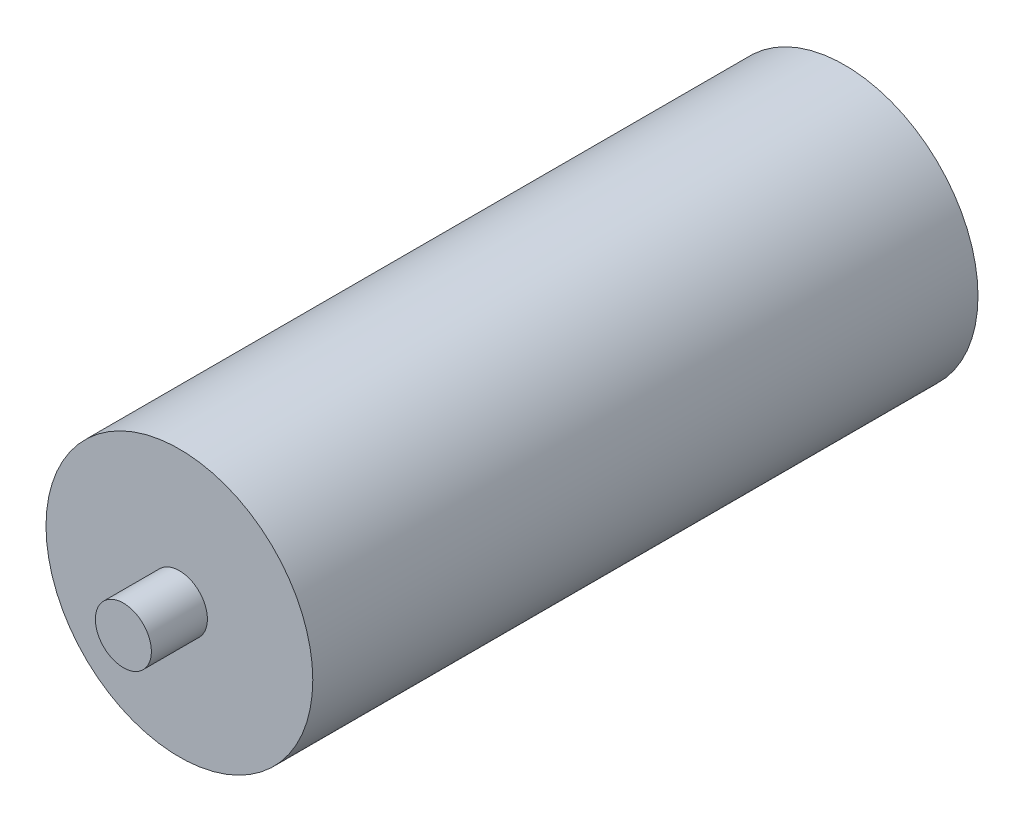
ISO-10303-21;
HEADER;
FILE_DESCRIPTION(('STEP AP214'),'2;1');
FILE_NAME('part.step','',(''),(''),'','','');
FILE_SCHEMA(('AUTOMOTIVE_DESIGN { 1 0 10303 214 1 1 1 1 }'));
ENDSEC;
DATA;
#1=APPLICATION_CONTEXT('core data for automotive mechanical design processes');
#2=APPLICATION_PROTOCOL_DEFINITION('international standard','automotive_design',2000,#1);
#3=PRODUCT_CONTEXT('',#1,'mechanical');
#4=PRODUCT('Part','Part','',(#3));
#5=PRODUCT_RELATED_PRODUCT_CATEGORY('part','',(#4));
#6=PRODUCT_DEFINITION_FORMATION('','',#4);
#7=PRODUCT_DEFINITION_CONTEXT('part definition',#1,'design');
#8=PRODUCT_DEFINITION('design','',#6,#7);
#9=PRODUCT_DEFINITION_SHAPE('','',#8);
#10=(LENGTH_UNIT() NAMED_UNIT(*) SI_UNIT(.MILLI.,.METRE.));
#11=(NAMED_UNIT(*) PLANE_ANGLE_UNIT() SI_UNIT($,.RADIAN.));
#12=(NAMED_UNIT(*) SI_UNIT($,.STERADIAN.) SOLID_ANGLE_UNIT());
#13=UNCERTAINTY_MEASURE_WITH_UNIT(LENGTH_MEASURE(1.E-05),#10,'distance_accuracy_value','');
#14=(GEOMETRIC_REPRESENTATION_CONTEXT(3) GLOBAL_UNCERTAINTY_ASSIGNED_CONTEXT((#13)) GLOBAL_UNIT_ASSIGNED_CONTEXT((#10,
#11,#12)) REPRESENTATION_CONTEXT('',''));
#15=CARTESIAN_POINT('',(0.,0.,0.));
#16=DIRECTION('',(0.,0.,1.));
#17=DIRECTION('',(1.,0.,0.));
#18=AXIS2_PLACEMENT_3D('',#15,#16,#17);
#19=CARTESIAN_POINT('',(0.,0.,47.498));
#20=DIRECTION('',(0.,0.,-1.));
#21=DIRECTION('',(-1.,0.,0.));
#22=AXIS2_PLACEMENT_3D('',#19,#20,#21);
#23=CYLINDRICAL_SURFACE('',#22,19.05);
#24=CARTESIAN_POINT('',(0.,0.,47.498));
#25=DIRECTION('',(0.,0.,1.));
#26=DIRECTION('',(1.,0.,0.));
#27=AXIS2_PLACEMENT_3D('',#24,#25,#26);
#28=CIRCLE('',#27,19.05);
#29=CARTESIAN_POINT('',(-19.05,0.,47.498));
#30=VERTEX_POINT('',#29);
#31=EDGE_CURVE('E43',#30,#30,#28,.T.);
#32=CARTESIAN_POINT('',(0.,0.,-47.498));
#33=DIRECTION('',(0.,0.,1.));
#34=DIRECTION('',(1.,0.,0.));
#35=AXIS2_PLACEMENT_3D('',#32,#33,#34);
#36=CIRCLE('',#35,19.05);
#37=CARTESIAN_POINT('',(-19.05,0.,-47.498));
#38=VERTEX_POINT('',#37);
#39=EDGE_CURVE('E47',#38,#38,#36,.T.);
#40=CARTESIAN_POINT('',(-19.05,0.,47.498));
#41=CARTESIAN_POINT('',(-19.05,0.,46.5084583333333));
#42=CARTESIAN_POINT('',(-19.05,0.,45.5189166666667));
#43=CARTESIAN_POINT('',(-19.05,0.,43.5398333333333));
#44=CARTESIAN_POINT('',(-19.05,0.,42.5502916666667));
#45=CARTESIAN_POINT('',(-19.05,0.,40.5712083333333));
#46=CARTESIAN_POINT('',(-19.05,0.,39.5816666666667));
#47=CARTESIAN_POINT('',(-19.05,0.,37.6025833333333));
#48=CARTESIAN_POINT('',(-19.05,0.,36.6130416666667));
#49=CARTESIAN_POINT('',(-19.05,0.,34.6339583333333));
#50=CARTESIAN_POINT('',(-19.05,0.,33.6444166666667));
#51=CARTESIAN_POINT('',(-19.05,0.,31.6653333333333));
#52=CARTESIAN_POINT('',(-19.05,0.,30.6757916666667));
#53=CARTESIAN_POINT('',(-19.05,0.,28.6967083333333));
#54=CARTESIAN_POINT('',(-19.05,0.,27.7071666666667));
#55=CARTESIAN_POINT('',(-19.05,0.,25.7280833333333));
#56=CARTESIAN_POINT('',(-19.05,0.,24.7385416666667));
#57=CARTESIAN_POINT('',(-19.05,0.,22.7594583333333));
#58=CARTESIAN_POINT('',(-19.05,0.,21.7699166666667));
#59=CARTESIAN_POINT('',(-19.05,0.,19.7908333333333));
#60=CARTESIAN_POINT('',(-19.05,0.,18.8012916666667));
#61=CARTESIAN_POINT('',(-19.05,0.,16.8222083333333));
#62=CARTESIAN_POINT('',(-19.05,0.,15.8326666666667));
#63=CARTESIAN_POINT('',(-19.05,0.,13.8535833333333));
#64=CARTESIAN_POINT('',(-19.05,0.,12.8640416666667));
#65=CARTESIAN_POINT('',(-19.05,0.,10.8849583333333));
#66=CARTESIAN_POINT('',(-19.05,0.,9.89541666666666));
#67=CARTESIAN_POINT('',(-19.05,0.,7.91633333333333));
#68=CARTESIAN_POINT('',(-19.05,0.,6.92679166666666));
#69=CARTESIAN_POINT('',(-19.05,0.,4.94770833333333));
#70=CARTESIAN_POINT('',(-19.05,0.,3.95816666666666));
#71=CARTESIAN_POINT('',(-19.05,0.,1.97908333333333));
#72=CARTESIAN_POINT('',(-19.05,0.,0.989541666666661));
#73=CARTESIAN_POINT('',(-19.05,0.,-0.989541666666675));
#74=CARTESIAN_POINT('',(-19.05,0.,-1.97908333333334));
#75=CARTESIAN_POINT('',(-19.05,0.,-3.95816666666668));
#76=CARTESIAN_POINT('',(-19.05,0.,-4.94770833333334));
#77=CARTESIAN_POINT('',(-19.05,0.,-6.92679166666668));
#78=CARTESIAN_POINT('',(-19.05,0.,-7.91633333333334));
#79=CARTESIAN_POINT('',(-19.05,0.,-9.89541666666667));
#80=CARTESIAN_POINT('',(-19.05,0.,-10.8849583333333));
#81=CARTESIAN_POINT('',(-19.05,0.,-12.8640416666667));
#82=CARTESIAN_POINT('',(-19.05,0.,-13.8535833333333));
#83=CARTESIAN_POINT('',(-19.05,0.,-15.8326666666667));
#84=CARTESIAN_POINT('',(-19.05,0.,-16.8222083333333));
#85=CARTESIAN_POINT('',(-19.05,0.,-18.8012916666667));
#86=CARTESIAN_POINT('',(-19.05,0.,-19.7908333333333));
#87=CARTESIAN_POINT('',(-19.05,0.,-21.7699166666667));
#88=CARTESIAN_POINT('',(-19.05,0.,-22.7594583333333));
#89=CARTESIAN_POINT('',(-19.05,0.,-24.7385416666667));
#90=CARTESIAN_POINT('',(-19.05,0.,-25.7280833333333));
#91=CARTESIAN_POINT('',(-19.05,0.,-27.7071666666667));
#92=CARTESIAN_POINT('',(-19.05,0.,-28.6967083333333));
#93=CARTESIAN_POINT('',(-19.05,0.,-30.6757916666667));
#94=CARTESIAN_POINT('',(-19.05,0.,-31.6653333333333));
#95=CARTESIAN_POINT('',(-19.05,0.,-33.6444166666667));
#96=CARTESIAN_POINT('',(-19.05,0.,-34.6339583333333));
#97=CARTESIAN_POINT('',(-19.05,0.,-36.6130416666667));
#98=CARTESIAN_POINT('',(-19.05,0.,-37.6025833333333));
#99=CARTESIAN_POINT('',(-19.05,0.,-39.5816666666667));
#100=CARTESIAN_POINT('',(-19.05,0.,-40.5712083333333));
#101=CARTESIAN_POINT('',(-19.05,0.,-42.5502916666667));
#102=CARTESIAN_POINT('',(-19.05,0.,-43.5398333333333));
#103=CARTESIAN_POINT('',(-19.05,0.,-45.5189166666667));
#104=CARTESIAN_POINT('',(-19.05,0.,-46.5084583333333));
#105=CARTESIAN_POINT('',(-19.05,0.,-47.498));
#106=B_SPLINE_CURVE_WITH_KNOTS('',3,(#40,#41,#42,#43,#44,#45,#46,#47,#48,#49,#50,#51,#52,#53,
#54,#55,#56,#57,#58,#59,#60,#61,#62,#63,#64,#65,#66,#67,#68,#69,#70,#71,#72,#73,#74,#75,#76,#77,
#78,#79,#80,#81,#82,#83,#84,#85,#86,#87,#88,#89,#90,#91,#92,#93,#94,#95,#96,#97,#98,#99,#100,
#101,#102,#103,#104,#105),.UNSPECIFIED.,.F.,.F.,(4,2,2,2,2,2,2,2,2,2,2,2,2,2,2,2,2,2,2,2,2,2,2,
2,2,2,2,2,2,2,2,2,4),(0.,2.968625,5.93725000000001,8.90587500000001,11.8745,14.843125,17.81175,
20.780375,23.749,26.717625,29.68625,32.654875,35.6235,38.592125,41.56075,44.529375,47.498,
50.466625,53.43525,56.403875,59.3725,62.341125,65.30975,68.278375,71.247,74.215625,77.18425,
80.152875,83.1215,86.090125,89.05875,92.027375,94.996),.UNSPECIFIED.);
#107=EDGE_CURVE('BSEAM37',#30,#38,#106,.T.);
#108=ORIENTED_EDGE('',*,*,#31,.F.);
#109=ORIENTED_EDGE('',*,*,#39,.T.);
#110=ORIENTED_EDGE('',*,*,#107,.T.);
#111=ORIENTED_EDGE('',*,*,#107,.F.);
#112=EDGE_LOOP('',(#108,#110,#109,#111));
#113=FACE_BOUND('',#112,.T.);
#114=ADVANCED_FACE('F37',(#113),#23,.T.);
#115=CARTESIAN_POINT('',(0.,0.,47.498));
#116=DIRECTION('',(0.,0.,1.));
#117=DIRECTION('',(1.,0.,0.));
#118=AXIS2_PLACEMENT_3D('',#115,#116,#117);
#119=PLANE('',#118);
#120=CARTESIAN_POINT('',(0.,0.,47.498));
#121=DIRECTION('',(0.,0.,1.));
#122=DIRECTION('',(1.,0.,0.));
#123=AXIS2_PLACEMENT_3D('',#120,#121,#122);
#124=CIRCLE('',#123,4.);
#125=CARTESIAN_POINT('',(4.,0.,47.498));
#126=VERTEX_POINT('',#125);
#127=EDGE_CURVE('E52',#126,#126,#124,.F.);
#128=ORIENTED_EDGE('',*,*,#127,.T.);
#129=EDGE_LOOP('',(#128));
#130=FACE_BOUND('',#129,.T.);
#131=ORIENTED_EDGE('',*,*,#31,.T.);
#132=EDGE_LOOP('',(#131));
#133=FACE_BOUND('',#132,.T.);
#134=ADVANCED_FACE('F81',(#130,#133),#119,.T.);
#135=CARTESIAN_POINT('',(0.,0.,-47.498));
#136=DIRECTION('',(0.,0.,1.));
#137=DIRECTION('',(1.,0.,0.));
#138=AXIS2_PLACEMENT_3D('',#135,#136,#137);
#139=PLANE('',#138);
#140=CARTESIAN_POINT('',(0.,0.,-47.498));
#141=DIRECTION('',(0.,0.,1.));
#142=DIRECTION('',(1.,0.,0.));
#143=AXIS2_PLACEMENT_3D('',#140,#141,#142);
#144=CIRCLE('',#143,4.);
#145=CARTESIAN_POINT('',(4.,0.,-47.498));
#146=VERTEX_POINT('',#145);
#147=EDGE_CURVE('E10',#146,#146,#144,.F.);
#148=ORIENTED_EDGE('',*,*,#147,.F.);
#149=EDGE_LOOP('',(#148));
#150=FACE_BOUND('',#149,.T.);
#151=ORIENTED_EDGE('',*,*,#39,.F.);
#152=EDGE_LOOP('',(#151));
#153=FACE_BOUND('',#152,.T.);
#154=ADVANCED_FACE('F86',(#150,#153),#139,.F.);
#155=CARTESIAN_POINT('',(0.,0.,-55.498));
#156=DIRECTION('',(0.,0.,1.));
#157=DIRECTION('',(1.,0.,0.));
#158=AXIS2_PLACEMENT_3D('',#155,#156,#157);
#159=PLANE('',#158);
#160=CARTESIAN_POINT('',(0.,0.,-55.498));
#161=DIRECTION('',(0.,0.,1.));
#162=DIRECTION('',(1.,0.,0.));
#163=AXIS2_PLACEMENT_3D('',#160,#161,#162);
#164=CIRCLE('',#163,4.);
#165=CARTESIAN_POINT('',(4.,0.,-55.498));
#166=VERTEX_POINT('',#165);
#167=EDGE_CURVE('E57',#166,#166,#164,.T.);
#168=ORIENTED_EDGE('',*,*,#167,.F.);
#169=EDGE_LOOP('',(#168));
#170=FACE_BOUND('',#169,.T.);
#171=ADVANCED_FACE('F75',(#170),#159,.F.);
#172=CARTESIAN_POINT('',(0.,0.,55.498));
#173=DIRECTION('',(0.,0.,-1.));
#174=DIRECTION('',(-1.,0.,0.));
#175=AXIS2_PLACEMENT_3D('',#172,#173,#174);
#176=CYLINDRICAL_SURFACE('',#175,4.);
#177=ORIENTED_EDGE('',*,*,#167,.T.);
#178=EDGE_LOOP('',(#177));
#179=FACE_BOUND('',#178,.T.);
#180=ORIENTED_EDGE('',*,*,#147,.T.);
#181=EDGE_LOOP('',(#180));
#182=FACE_BOUND('',#181,.T.);
#183=ADVANCED_FACE('F67',(#179,#182),#176,.T.);
#184=ORIENTED_EDGE('',*,*,#127,.F.);
#185=EDGE_LOOP('',(#184));
#186=FACE_BOUND('',#185,.T.);
#187=CARTESIAN_POINT('',(0.,0.,55.498));
#188=DIRECTION('',(0.,0.,1.));
#189=DIRECTION('',(1.,0.,0.));
#190=AXIS2_PLACEMENT_3D('',#187,#188,#189);
#191=CIRCLE('',#190,4.);
#192=CARTESIAN_POINT('',(4.,0.,55.498));
#193=VERTEX_POINT('',#192);
#194=EDGE_CURVE('E56',#193,#193,#191,.T.);
#195=ORIENTED_EDGE('',*,*,#194,.F.);
#196=EDGE_LOOP('',(#195));
#197=FACE_BOUND('',#196,.T.);
#198=ADVANCED_FACE('F65',(#186,#197),#176,.T.);
#199=CARTESIAN_POINT('',(0.,0.,55.498));
#200=DIRECTION('',(0.,0.,1.));
#201=DIRECTION('',(1.,0.,0.));
#202=AXIS2_PLACEMENT_3D('',#199,#200,#201);
#203=PLANE('',#202);
#204=ORIENTED_EDGE('',*,*,#194,.T.);
#205=EDGE_LOOP('',(#204));
#206=FACE_BOUND('',#205,.T.);
#207=ADVANCED_FACE('F63',(#206),#203,.T.);
#208=CLOSED_SHELL('',(#114,#134,#154,#171,#183,#198,#207));
#209=MANIFOLD_SOLID_BREP('B2',#208);
#210=ADVANCED_BREP_SHAPE_REPRESENTATION('',(#18,#209),#14);
#211=SHAPE_DEFINITION_REPRESENTATION(#9,#210);
ENDSEC;
END-ISO-10303-21;
